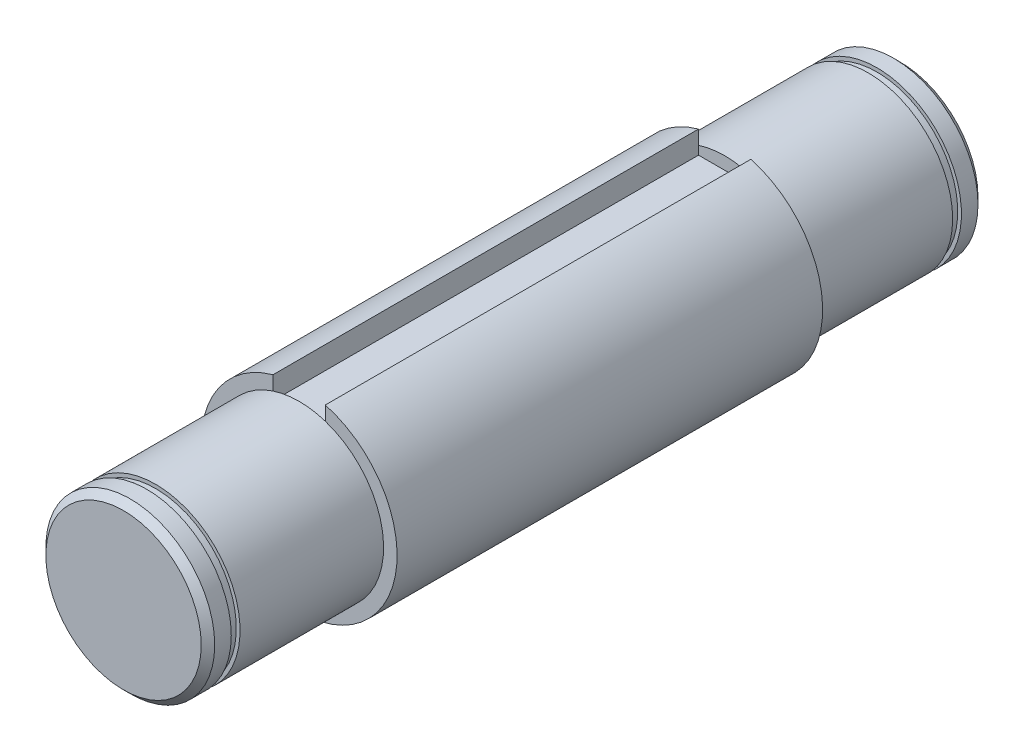
ISO-10303-21;
HEADER;
FILE_DESCRIPTION(('STEP AP214'),'2;1');
FILE_NAME('part.step','',(''),(''),'','','');
FILE_SCHEMA(('AUTOMOTIVE_DESIGN { 1 0 10303 214 1 1 1 1 }'));
ENDSEC;
DATA;
#1=APPLICATION_CONTEXT('core data for automotive mechanical design processes');
#2=APPLICATION_PROTOCOL_DEFINITION('international standard','automotive_design',2000,#1);
#3=PRODUCT_CONTEXT('',#1,'mechanical');
#4=PRODUCT('Part','Part','',(#3));
#5=PRODUCT_RELATED_PRODUCT_CATEGORY('part','',(#4));
#6=PRODUCT_DEFINITION_FORMATION('','',#4);
#7=PRODUCT_DEFINITION_CONTEXT('part definition',#1,'design');
#8=PRODUCT_DEFINITION('design','',#6,#7);
#9=PRODUCT_DEFINITION_SHAPE('','',#8);
#10=(LENGTH_UNIT() NAMED_UNIT(*) SI_UNIT(.MILLI.,.METRE.));
#11=(NAMED_UNIT(*) PLANE_ANGLE_UNIT() SI_UNIT($,.RADIAN.));
#12=(NAMED_UNIT(*) SI_UNIT($,.STERADIAN.) SOLID_ANGLE_UNIT());
#13=UNCERTAINTY_MEASURE_WITH_UNIT(LENGTH_MEASURE(1.E-05),#10,'distance_accuracy_value','');
#14=(GEOMETRIC_REPRESENTATION_CONTEXT(3) GLOBAL_UNCERTAINTY_ASSIGNED_CONTEXT((#13)) GLOBAL_UNIT_ASSIGNED_CONTEXT((#10,
#11,#12)) REPRESENTATION_CONTEXT('',''));
#15=CARTESIAN_POINT('',(0.,0.,0.));
#16=DIRECTION('',(0.,0.,1.));
#17=DIRECTION('',(1.,0.,0.));
#18=AXIS2_PLACEMENT_3D('',#15,#16,#17);
#19=CARTESIAN_POINT('',(0.,0.,89.));
#20=DIRECTION('',(0.,0.,-1.));
#21=DIRECTION('',(-1.,0.,0.));
#22=AXIS2_PLACEMENT_3D('',#19,#20,#21);
#23=CYLINDRICAL_SURFACE('',#22,14.5);
#24=CARTESIAN_POINT('',(0.,0.,89.));
#25=DIRECTION('',(0.,0.,-1.));
#26=DIRECTION('',(-1.,0.,0.));
#27=AXIS2_PLACEMENT_3D('',#24,#25,#26);
#28=CIRCLE('',#27,14.5);
#29=CARTESIAN_POINT('',(3.875,13.9726294948374,89.));
#30=VERTEX_POINT('',#29);
#31=CARTESIAN_POINT('',(-3.875,13.9726294948374,89.));
#32=VERTEX_POINT('',#31);
#33=EDGE_CURVE('E158',#30,#32,#28,.T.);
#34=ORIENTED_EDGE('',*,*,#33,.T.);
#35=DIRECTION('',(0.,0.,-1.));
#36=VECTOR('',#35,1.);
#37=CARTESIAN_POINT('',(-3.875,13.9726294948374,89.));
#38=LINE('',#37,#36);
#39=CARTESIAN_POINT('',(-3.875,13.9726294948374,26.));
#40=VERTEX_POINT('',#39);
#41=EDGE_CURVE('E74',#32,#40,#38,.T.);
#42=ORIENTED_EDGE('',*,*,#41,.T.);
#43=CARTESIAN_POINT('',(0.,0.,26.));
#44=DIRECTION('',(0.,0.,-1.));
#45=DIRECTION('',(-1.,0.,0.));
#46=AXIS2_PLACEMENT_3D('',#43,#44,#45);
#47=CIRCLE('',#46,14.5);
#48=CARTESIAN_POINT('',(3.875,13.9726294948374,26.));
#49=VERTEX_POINT('',#48);
#50=EDGE_CURVE('E154',#49,#40,#47,.T.);
#51=ORIENTED_EDGE('',*,*,#50,.F.);
#52=DIRECTION('',(0.,0.,-1.));
#53=VECTOR('',#52,1.);
#54=CARTESIAN_POINT('',(3.875,13.9726294948374,89.));
#55=LINE('',#54,#53);
#56=EDGE_CURVE('E149',#30,#49,#55,.T.);
#57=ORIENTED_EDGE('',*,*,#56,.F.);
#58=EDGE_LOOP('',(#34,#42,#51,#57));
#59=FACE_BOUND('',#58,.T.);
#60=ADVANCED_FACE('F49',(#59),#23,.T.);
#61=CARTESIAN_POINT('',(0.,0.,89.));
#62=DIRECTION('',(0.,0.,-1.));
#63=DIRECTION('',(-1.,0.,0.));
#64=AXIS2_PLACEMENT_3D('',#61,#62,#63);
#65=PLANE('',#64);
#66=DIRECTION('',(0.,1.,0.));
#67=VECTOR('',#66,1.);
#68=CARTESIAN_POINT('',(-3.875,18.375,89.));
#69=LINE('',#68,#67);
#70=CARTESIAN_POINT('',(-3.875,11.8842069571343,89.));
#71=VERTEX_POINT('',#70);
#72=EDGE_CURVE('E139',#71,#32,#69,.T.);
#73=ORIENTED_EDGE('',*,*,#72,.T.);
#74=ORIENTED_EDGE('',*,*,#33,.F.);
#75=DIRECTION('',(0.,1.,0.));
#76=VECTOR('',#75,1.);
#77=CARTESIAN_POINT('',(3.875,18.375,89.));
#78=LINE('',#77,#76);
#79=CARTESIAN_POINT('',(3.875,11.8842069571343,89.));
#80=VERTEX_POINT('',#79);
#81=EDGE_CURVE('E142',#80,#30,#78,.T.);
#82=ORIENTED_EDGE('',*,*,#81,.F.);
#83=CARTESIAN_POINT('',(0.,0.,89.));
#84=DIRECTION('',(0.,0.,-1.));
#85=DIRECTION('',(-1.,0.,0.));
#86=AXIS2_PLACEMENT_3D('',#83,#84,#85);
#87=CIRCLE('',#86,12.5);
#88=EDGE_CURVE('E165',#80,#71,#87,.T.);
#89=ORIENTED_EDGE('',*,*,#88,.T.);
#90=EDGE_LOOP('',(#73,#74,#82,#89));
#91=FACE_BOUND('',#90,.T.);
#92=ADVANCED_FACE('F214',(#91),#65,.F.);
#93=CARTESIAN_POINT('',(0.,0.,26.));
#94=DIRECTION('',(0.,0.,-1.));
#95=DIRECTION('',(-1.,0.,0.));
#96=AXIS2_PLACEMENT_3D('',#93,#94,#95);
#97=PLANE('',#96);
#98=ORIENTED_EDGE('',*,*,#50,.T.);
#99=DIRECTION('',(0.,-1.,0.));
#100=VECTOR('',#99,1.);
#101=CARTESIAN_POINT('',(-3.875,18.375,26.));
#102=LINE('',#101,#100);
#103=CARTESIAN_POINT('',(-3.875,11.8842069571343,26.));
#104=VERTEX_POINT('',#103);
#105=EDGE_CURVE('E113',#40,#104,#102,.T.);
#106=ORIENTED_EDGE('',*,*,#105,.T.);
#107=CARTESIAN_POINT('',(0.,0.,26.));
#108=DIRECTION('',(0.,0.,-1.));
#109=DIRECTION('',(-1.,0.,0.));
#110=AXIS2_PLACEMENT_3D('',#107,#108,#109);
#111=CIRCLE('',#110,12.5);
#112=CARTESIAN_POINT('',(3.875,11.8842069571343,26.));
#113=VERTEX_POINT('',#112);
#114=EDGE_CURVE('E162',#113,#104,#111,.T.);
#115=ORIENTED_EDGE('',*,*,#114,.F.);
#116=DIRECTION('',(0.,-1.,0.));
#117=VECTOR('',#116,1.);
#118=CARTESIAN_POINT('',(3.875,18.375,26.));
#119=LINE('',#118,#117);
#120=EDGE_CURVE('E66',#49,#113,#119,.T.);
#121=ORIENTED_EDGE('',*,*,#120,.F.);
#122=EDGE_LOOP('',(#98,#106,#115,#121));
#123=FACE_BOUND('',#122,.T.);
#124=ADVANCED_FACE('F220',(#123),#97,.T.);
#125=CARTESIAN_POINT('',(0.,0.,115.));
#126=DIRECTION('',(0.,0.,-1.));
#127=DIRECTION('',(-1.,0.,0.));
#128=AXIS2_PLACEMENT_3D('',#125,#126,#127);
#129=CYLINDRICAL_SURFACE('',#128,12.5);
#130=CARTESIAN_POINT('',(0.,0.,110.25));
#131=DIRECTION('',(0.,0.,-1.));
#132=DIRECTION('',(-1.,0.,0.));
#133=AXIS2_PLACEMENT_3D('',#130,#131,#132);
#134=CIRCLE('',#133,12.5);
#135=CARTESIAN_POINT('',(-12.5,0.,110.25));
#136=VERTEX_POINT('',#135);
#137=EDGE_CURVE('E179',#136,#136,#134,.T.);
#138=ORIENTED_EDGE('',*,*,#137,.T.);
#139=EDGE_LOOP('',(#138));
#140=FACE_BOUND('',#139,.T.);
#141=EDGE_CURVE('E166',#71,#80,#87,.T.);
#142=ORIENTED_EDGE('',*,*,#141,.F.);
#143=ORIENTED_EDGE('',*,*,#88,.F.);
#144=EDGE_LOOP('',(#142,#143));
#145=FACE_BOUND('',#144,.T.);
#146=ADVANCED_FACE('F238',(#140,#145),#129,.T.);
#147=CARTESIAN_POINT('',(0.,0.,4.75));
#148=DIRECTION('',(0.,0.,1.));
#149=DIRECTION('',(1.,0.,0.));
#150=AXIS2_PLACEMENT_3D('',#147,#148,#149);
#151=CIRCLE('',#150,12.5);
#152=CARTESIAN_POINT('',(12.5,0.,4.75));
#153=VERTEX_POINT('',#152);
#154=EDGE_CURVE('E170',#153,#153,#151,.T.);
#155=ORIENTED_EDGE('',*,*,#154,.T.);
#156=EDGE_LOOP('',(#155));
#157=FACE_BOUND('',#156,.T.);
#158=EDGE_CURVE('E110',#104,#113,#111,.T.);
#159=ORIENTED_EDGE('',*,*,#158,.T.);
#160=ORIENTED_EDGE('',*,*,#114,.T.);
#161=EDGE_LOOP('',(#159,#160));
#162=FACE_BOUND('',#161,.T.);
#163=ADVANCED_FACE('F235',(#157,#162),#129,.T.);
#164=CARTESIAN_POINT('',(0.,0.,89.));
#165=DIRECTION('',(0.,0.,-1.));
#166=DIRECTION('',(-1.,0.,0.));
#167=AXIS2_PLACEMENT_3D('',#164,#165,#166);
#168=PLANE('',#167);
#169=ORIENTED_EDGE('',*,*,#141,.T.);
#170=CARTESIAN_POINT('',(3.875,10.625,89.));
#171=VERTEX_POINT('',#170);
#172=EDGE_CURVE('E145',#171,#80,#78,.T.);
#173=ORIENTED_EDGE('',*,*,#172,.F.);
#174=DIRECTION('',(1.,0.,0.));
#175=VECTOR('',#174,1.);
#176=CARTESIAN_POINT('',(3.875,10.625,89.));
#177=LINE('',#176,#175);
#178=CARTESIAN_POINT('',(-3.875,10.625,89.));
#179=VERTEX_POINT('',#178);
#180=EDGE_CURVE('E123',#179,#171,#177,.T.);
#181=ORIENTED_EDGE('',*,*,#180,.F.);
#182=EDGE_CURVE('E119',#179,#71,#69,.T.);
#183=ORIENTED_EDGE('',*,*,#182,.T.);
#184=EDGE_LOOP('',(#169,#173,#181,#183));
#185=FACE_BOUND('',#184,.T.);
#186=ADVANCED_FACE('F237',(#185),#168,.T.);
#187=CARTESIAN_POINT('',(0.,0.,26.));
#188=DIRECTION('',(0.,0.,-1.));
#189=DIRECTION('',(-1.,0.,0.));
#190=AXIS2_PLACEMENT_3D('',#187,#188,#189);
#191=PLANE('',#190);
#192=CARTESIAN_POINT('',(-3.875,10.625,26.));
#193=VERTEX_POINT('',#192);
#194=EDGE_CURVE('E104',#104,#193,#102,.T.);
#195=ORIENTED_EDGE('',*,*,#194,.T.);
#196=DIRECTION('',(-1.,0.,0.));
#197=VECTOR('',#196,1.);
#198=CARTESIAN_POINT('',(3.875,10.625,26.));
#199=LINE('',#198,#197);
#200=CARTESIAN_POINT('',(3.875,10.625,26.));
#201=VERTEX_POINT('',#200);
#202=EDGE_CURVE('E108',#201,#193,#199,.T.);
#203=ORIENTED_EDGE('',*,*,#202,.F.);
#204=EDGE_CURVE('E134',#113,#201,#119,.T.);
#205=ORIENTED_EDGE('',*,*,#204,.F.);
#206=ORIENTED_EDGE('',*,*,#158,.F.);
#207=EDGE_LOOP('',(#195,#203,#205,#206));
#208=FACE_BOUND('',#207,.T.);
#209=ADVANCED_FACE('F106',(#208),#191,.F.);
#210=CARTESIAN_POINT('',(-3.875,18.375,99.9601551083915));
#211=DIRECTION('',(1.,0.,0.));
#212=DIRECTION('',(0.,1.,0.));
#213=AXIS2_PLACEMENT_3D('',#210,#211,#212);
#214=PLANE('',#213);
#215=ORIENTED_EDGE('',*,*,#72,.F.);
#216=ORIENTED_EDGE('',*,*,#182,.F.);
#217=DIRECTION('',(0.,0.,-1.));
#218=VECTOR('',#217,1.);
#219=CARTESIAN_POINT('',(-3.875,10.625,99.9601551083915));
#220=LINE('',#219,#218);
#221=EDGE_CURVE('E116',#179,#193,#220,.T.);
#222=ORIENTED_EDGE('',*,*,#221,.T.);
#223=ORIENTED_EDGE('',*,*,#194,.F.);
#224=ORIENTED_EDGE('',*,*,#105,.F.);
#225=ORIENTED_EDGE('',*,*,#41,.F.);
#226=EDGE_LOOP('',(#215,#216,#222,#223,#224,#225));
#227=FACE_BOUND('',#226,.T.);
#228=ADVANCED_FACE('F117',(#227),#214,.T.);
#229=CARTESIAN_POINT('',(3.875,10.625,99.9601551083915));
#230=DIRECTION('',(0.,-1.,0.));
#231=DIRECTION('',(0.,0.,-1.));
#232=AXIS2_PLACEMENT_3D('',#229,#230,#231);
#233=PLANE('',#232);
#234=ORIENTED_EDGE('',*,*,#180,.T.);
#235=DIRECTION('',(0.,0.,-1.));
#236=VECTOR('',#235,1.);
#237=CARTESIAN_POINT('',(3.875,10.625,99.9601551083915));
#238=LINE('',#237,#236);
#239=EDGE_CURVE('E124',#171,#201,#238,.T.);
#240=ORIENTED_EDGE('',*,*,#239,.T.);
#241=ORIENTED_EDGE('',*,*,#202,.T.);
#242=ORIENTED_EDGE('',*,*,#221,.F.);
#243=EDGE_LOOP('',(#234,#240,#241,#242));
#244=FACE_BOUND('',#243,.T.);
#245=ADVANCED_FACE('F127',(#244),#233,.F.);
#246=CARTESIAN_POINT('',(3.875,18.375,99.9601551083915));
#247=DIRECTION('',(1.,0.,0.));
#248=DIRECTION('',(0.,1.,0.));
#249=AXIS2_PLACEMENT_3D('',#246,#247,#248);
#250=PLANE('',#249);
#251=ORIENTED_EDGE('',*,*,#56,.T.);
#252=ORIENTED_EDGE('',*,*,#120,.T.);
#253=ORIENTED_EDGE('',*,*,#204,.T.);
#254=ORIENTED_EDGE('',*,*,#239,.F.);
#255=ORIENTED_EDGE('',*,*,#172,.T.);
#256=ORIENTED_EDGE('',*,*,#81,.T.);
#257=EDGE_LOOP('',(#251,#252,#253,#254,#255,#256));
#258=FACE_BOUND('',#257,.T.);
#259=ADVANCED_FACE('F285',(#258),#250,.F.);
#260=CARTESIAN_POINT('',(-13.05,0.,3.45000000000001));
#261=DIRECTION('',(0.,0.,-1.));
#262=DIRECTION('',(-1.,0.,0.));
#263=AXIS2_PLACEMENT_3D('',#260,#261,#262);
#264=PLANE('',#263);
#265=CARTESIAN_POINT('',(0.,0.,3.45000000000001));
#266=DIRECTION('',(0.,0.,-1.));
#267=DIRECTION('',(-1.,0.,0.));
#268=AXIS2_PLACEMENT_3D('',#265,#266,#267);
#269=CIRCLE('',#268,11.95);
#270=CARTESIAN_POINT('',(-11.95,0.,3.45000000000001));
#271=VERTEX_POINT('',#270);
#272=EDGE_CURVE('E175',#271,#271,#269,.T.);
#273=ORIENTED_EDGE('',*,*,#272,.T.);
#274=EDGE_LOOP('',(#273));
#275=FACE_BOUND('',#274,.T.);
#276=CARTESIAN_POINT('',(0.,0.,3.45000000000001));
#277=DIRECTION('',(0.,0.,-1.));
#278=DIRECTION('',(-1.,0.,0.));
#279=AXIS2_PLACEMENT_3D('',#276,#277,#278);
#280=CIRCLE('',#279,12.5);
#281=CARTESIAN_POINT('',(-12.5,0.,3.45000000000001));
#282=VERTEX_POINT('',#281);
#283=EDGE_CURVE('E174',#282,#282,#280,.T.);
#284=ORIENTED_EDGE('',*,*,#283,.F.);
#285=EDGE_LOOP('',(#284));
#286=FACE_BOUND('',#285,.T.);
#287=ADVANCED_FACE('F282',(#275,#286),#264,.F.);
#288=CARTESIAN_POINT('',(-13.05,0.,4.75000000000001));
#289=DIRECTION('',(0.,0.,1.));
#290=DIRECTION('',(1.,0.,0.));
#291=AXIS2_PLACEMENT_3D('',#288,#289,#290);
#292=PLANE('',#291);
#293=CARTESIAN_POINT('',(0.,0.,4.75000000000001));
#294=DIRECTION('',(0.,0.,-1.));
#295=DIRECTION('',(-1.,0.,0.));
#296=AXIS2_PLACEMENT_3D('',#293,#294,#295);
#297=CIRCLE('',#296,11.95);
#298=CARTESIAN_POINT('',(-11.95,0.,4.75000000000001));
#299=VERTEX_POINT('',#298);
#300=EDGE_CURVE('E188',#299,#299,#297,.T.);
#301=ORIENTED_EDGE('',*,*,#300,.F.);
#302=EDGE_LOOP('',(#301));
#303=FACE_BOUND('',#302,.T.);
#304=ORIENTED_EDGE('',*,*,#154,.F.);
#305=EDGE_LOOP('',(#304));
#306=FACE_BOUND('',#305,.T.);
#307=ADVANCED_FACE('F279',(#303,#306),#292,.F.);
#308=CARTESIAN_POINT('',(0.,0.,0.));
#309=DIRECTION('',(0.,0.,-1.));
#310=DIRECTION('',(-1.,0.,0.));
#311=AXIS2_PLACEMENT_3D('',#308,#309,#310);
#312=CYLINDRICAL_SURFACE('',#311,11.95);
#313=ORIENTED_EDGE('',*,*,#272,.F.);
#314=EDGE_LOOP('',(#313));
#315=FACE_BOUND('',#314,.T.);
#316=ORIENTED_EDGE('',*,*,#300,.T.);
#317=EDGE_LOOP('',(#316));
#318=FACE_BOUND('',#317,.T.);
#319=ADVANCED_FACE('F233',(#315,#318),#312,.T.);
#320=CARTESIAN_POINT('',(0.,0.,0.));
#321=DIRECTION('',(0.,0.,1.));
#322=DIRECTION('',(1.,0.,0.));
#323=AXIS2_PLACEMENT_3D('',#320,#321,#322);
#324=PLANE('',#323);
#325=CARTESIAN_POINT('',(0.,0.,0.));
#326=DIRECTION('',(0.,0.,1.));
#327=DIRECTION('',(1.,0.,0.));
#328=AXIS2_PLACEMENT_3D('',#325,#326,#327);
#329=CIRCLE('',#328,11.5);
#330=CARTESIAN_POINT('',(11.5,0.,0.));
#331=VERTEX_POINT('',#330);
#332=EDGE_CURVE('E11',#331,#331,#329,.F.);
#333=ORIENTED_EDGE('',*,*,#332,.T.);
#334=EDGE_LOOP('',(#333));
#335=FACE_BOUND('',#334,.T.);
#336=ADVANCED_FACE('F230',(#335),#324,.F.);
#337=CARTESIAN_POINT('',(0.,0.,1.00000000000001));
#338=DIRECTION('',(0.,0.,1.));
#339=DIRECTION('',(1.,0.,0.));
#340=AXIS2_PLACEMENT_3D('',#337,#338,#339);
#341=CIRCLE('',#340,12.5);
#342=CARTESIAN_POINT('',(12.5,0.,1.00000000000001));
#343=VERTEX_POINT('',#342);
#344=EDGE_CURVE('E59',#343,#343,#341,.T.);
#345=ORIENTED_EDGE('',*,*,#344,.T.);
#346=EDGE_LOOP('',(#345));
#347=FACE_BOUND('',#346,.T.);
#348=ORIENTED_EDGE('',*,*,#283,.T.);
#349=EDGE_LOOP('',(#348));
#350=FACE_BOUND('',#349,.T.);
#351=ADVANCED_FACE('F201',(#347,#350),#129,.T.);
#352=CARTESIAN_POINT('',(-13.05,0.,111.55));
#353=DIRECTION('',(0.,0.,1.));
#354=DIRECTION('',(-1.,0.,0.));
#355=AXIS2_PLACEMENT_3D('',#352,#353,#354);
#356=PLANE('',#355);
#357=CARTESIAN_POINT('',(0.,0.,111.55));
#358=DIRECTION('',(0.,0.,-1.));
#359=DIRECTION('',(-1.,0.,0.));
#360=AXIS2_PLACEMENT_3D('',#357,#358,#359);
#361=CIRCLE('',#360,11.95);
#362=CARTESIAN_POINT('',(-11.95,0.,111.55));
#363=VERTEX_POINT('',#362);
#364=EDGE_CURVE('E184',#363,#363,#361,.T.);
#365=ORIENTED_EDGE('',*,*,#364,.F.);
#366=EDGE_LOOP('',(#365));
#367=FACE_BOUND('',#366,.T.);
#368=CARTESIAN_POINT('',(0.,0.,111.55));
#369=DIRECTION('',(0.,0.,1.));
#370=DIRECTION('',(1.,0.,0.));
#371=AXIS2_PLACEMENT_3D('',#368,#369,#370);
#372=CIRCLE('',#371,12.5);
#373=CARTESIAN_POINT('',(12.5,0.,111.55));
#374=VERTEX_POINT('',#373);
#375=EDGE_CURVE('E183',#374,#374,#372,.T.);
#376=ORIENTED_EDGE('',*,*,#375,.F.);
#377=EDGE_LOOP('',(#376));
#378=FACE_BOUND('',#377,.T.);
#379=ADVANCED_FACE('F261',(#367,#378),#356,.F.);
#380=CARTESIAN_POINT('',(-13.05,0.,110.25));
#381=DIRECTION('',(0.,0.,-1.));
#382=DIRECTION('',(1.,0.,0.));
#383=AXIS2_PLACEMENT_3D('',#380,#381,#382);
#384=PLANE('',#383);
#385=CARTESIAN_POINT('',(0.,0.,110.25));
#386=DIRECTION('',(0.,0.,-1.));
#387=DIRECTION('',(-1.,0.,0.));
#388=AXIS2_PLACEMENT_3D('',#385,#386,#387);
#389=CIRCLE('',#388,11.95);
#390=CARTESIAN_POINT('',(-11.95,0.,110.25));
#391=VERTEX_POINT('',#390);
#392=EDGE_CURVE('E353',#391,#391,#389,.T.);
#393=ORIENTED_EDGE('',*,*,#392,.T.);
#394=EDGE_LOOP('',(#393));
#395=FACE_BOUND('',#394,.T.);
#396=ORIENTED_EDGE('',*,*,#137,.F.);
#397=EDGE_LOOP('',(#396));
#398=FACE_BOUND('',#397,.T.);
#399=ADVANCED_FACE('F265',(#395,#398),#384,.F.);
#400=CARTESIAN_POINT('',(0.,0.,115.));
#401=DIRECTION('',(0.,0.,1.));
#402=DIRECTION('',(-1.,0.,0.));
#403=AXIS2_PLACEMENT_3D('',#400,#401,#402);
#404=CYLINDRICAL_SURFACE('',#403,11.95);
#405=ORIENTED_EDGE('',*,*,#364,.T.);
#406=EDGE_LOOP('',(#405));
#407=FACE_BOUND('',#406,.T.);
#408=ORIENTED_EDGE('',*,*,#392,.F.);
#409=EDGE_LOOP('',(#408));
#410=FACE_BOUND('',#409,.T.);
#411=ADVANCED_FACE('F228',(#407,#410),#404,.T.);
#412=CARTESIAN_POINT('',(0.,0.,115.));
#413=DIRECTION('',(0.,0.,1.));
#414=DIRECTION('',(1.,0.,0.));
#415=AXIS2_PLACEMENT_3D('',#412,#413,#414);
#416=PLANE('',#415);
#417=CARTESIAN_POINT('',(0.,0.,115.));
#418=DIRECTION('',(0.,0.,1.));
#419=DIRECTION('',(1.,0.,0.));
#420=AXIS2_PLACEMENT_3D('',#417,#418,#419);
#421=CIRCLE('',#420,11.5);
#422=CARTESIAN_POINT('',(11.5,0.,115.));
#423=VERTEX_POINT('',#422);
#424=EDGE_CURVE('E169',#423,#423,#421,.T.);
#425=ORIENTED_EDGE('',*,*,#424,.T.);
#426=EDGE_LOOP('',(#425));
#427=FACE_BOUND('',#426,.T.);
#428=ADVANCED_FACE('F225',(#427),#416,.T.);
#429=CARTESIAN_POINT('',(0.,0.,114.));
#430=DIRECTION('',(0.,0.,1.));
#431=DIRECTION('',(1.,0.,0.));
#432=AXIS2_PLACEMENT_3D('',#429,#430,#431);
#433=CIRCLE('',#432,12.5);
#434=CARTESIAN_POINT('',(12.5,0.,114.));
#435=VERTEX_POINT('',#434);
#436=EDGE_CURVE('E192',#435,#435,#433,.F.);
#437=ORIENTED_EDGE('',*,*,#436,.T.);
#438=EDGE_LOOP('',(#437));
#439=FACE_BOUND('',#438,.T.);
#440=ORIENTED_EDGE('',*,*,#375,.T.);
#441=EDGE_LOOP('',(#440));
#442=FACE_BOUND('',#441,.T.);
#443=ADVANCED_FACE('F210',(#439,#442),#129,.T.);
#444=CARTESIAN_POINT('',(0.,0.,115.));
#445=DIRECTION('',(0.,0.,-1.));
#446=DIRECTION('',(-1.,0.,0.));
#447=AXIS2_PLACEMENT_3D('',#444,#445,#446);
#448=CONICAL_SURFACE('',#447,11.5,0.785398163397443);
#449=ORIENTED_EDGE('',*,*,#436,.F.);
#450=EDGE_LOOP('',(#449));
#451=FACE_BOUND('',#450,.T.);
#452=ORIENTED_EDGE('',*,*,#424,.F.);
#453=EDGE_LOOP('',(#452));
#454=FACE_BOUND('',#453,.T.);
#455=ADVANCED_FACE('F205',(#451,#454),#448,.T.);
#456=CARTESIAN_POINT('',(0.,0.,1.00000000000001));
#457=DIRECTION('',(0.,0.,1.));
#458=DIRECTION('',(1.,0.,0.));
#459=AXIS2_PLACEMENT_3D('',#456,#457,#458);
#460=CONICAL_SURFACE('',#459,12.5,0.78539816339745);
#461=ORIENTED_EDGE('',*,*,#332,.F.);
#462=EDGE_LOOP('',(#461));
#463=FACE_BOUND('',#462,.T.);
#464=ORIENTED_EDGE('',*,*,#344,.F.);
#465=EDGE_LOOP('',(#464));
#466=FACE_BOUND('',#465,.T.);
#467=ADVANCED_FACE('F52',(#463,#466),#460,.T.);
#468=CLOSED_SHELL('',(#60,#92,#124,#146,#163,#186,#209,#228,#245,#259,#287,#307,#319,#336,#351,
#379,#399,#411,#428,#443,#455,#467));
#469=MANIFOLD_SOLID_BREP('B2',#468);
#470=ADVANCED_BREP_SHAPE_REPRESENTATION('',(#18,#469),#14);
#471=SHAPE_DEFINITION_REPRESENTATION(#9,#470);
ENDSEC;
END-ISO-10303-21;
